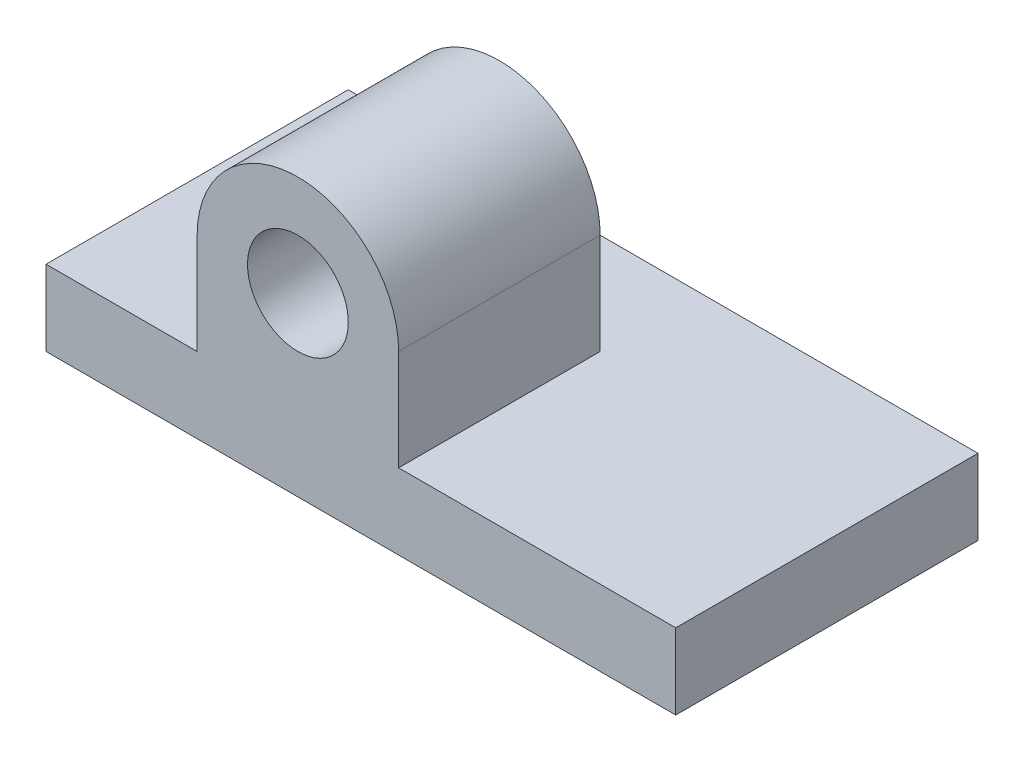
ISO-10303-21;
HEADER;
FILE_DESCRIPTION(('STEP AP214'),'2;1');
FILE_NAME('part.step','',(''),(''),'','','');
FILE_SCHEMA(('AUTOMOTIVE_DESIGN { 1 0 10303 214 1 1 1 1 }'));
ENDSEC;
DATA;
#1=APPLICATION_CONTEXT('core data for automotive mechanical design processes');
#2=APPLICATION_PROTOCOL_DEFINITION('international standard','automotive_design',2000,#1);
#3=PRODUCT_CONTEXT('',#1,'mechanical');
#4=PRODUCT('Part','Part','',(#3));
#5=PRODUCT_RELATED_PRODUCT_CATEGORY('part','',(#4));
#6=PRODUCT_DEFINITION_FORMATION('','',#4);
#7=PRODUCT_DEFINITION_CONTEXT('part definition',#1,'design');
#8=PRODUCT_DEFINITION('design','',#6,#7);
#9=PRODUCT_DEFINITION_SHAPE('','',#8);
#10=(LENGTH_UNIT() NAMED_UNIT(*) SI_UNIT(.MILLI.,.METRE.));
#11=(NAMED_UNIT(*) PLANE_ANGLE_UNIT() SI_UNIT($,.RADIAN.));
#12=(NAMED_UNIT(*) SI_UNIT($,.STERADIAN.) SOLID_ANGLE_UNIT());
#13=UNCERTAINTY_MEASURE_WITH_UNIT(LENGTH_MEASURE(1.E-05),#10,'distance_accuracy_value','');
#14=(GEOMETRIC_REPRESENTATION_CONTEXT(3) GLOBAL_UNCERTAINTY_ASSIGNED_CONTEXT((#13)) GLOBAL_UNIT_ASSIGNED_CONTEXT((#10,
#11,#12)) REPRESENTATION_CONTEXT('',''));
#15=CARTESIAN_POINT('',(0.,0.,0.));
#16=DIRECTION('',(0.,0.,1.));
#17=DIRECTION('',(1.,0.,0.));
#18=AXIS2_PLACEMENT_3D('',#15,#16,#17);
#19=CARTESIAN_POINT('',(0.,15.,-60.));
#20=DIRECTION('',(0.,-1.,0.));
#21=DIRECTION('',(0.,0.,-1.));
#22=AXIS2_PLACEMENT_3D('',#19,#20,#21);
#23=PLANE('',#22);
#24=DIRECTION('',(0.,0.,1.));
#25=VECTOR('',#24,1.);
#26=CARTESIAN_POINT('',(30.,15.,-40.));
#27=LINE('',#26,#25);
#28=CARTESIAN_POINT('',(30.,15.,-40.));
#29=VERTEX_POINT('',#28);
#30=CARTESIAN_POINT('',(30.,15.,0.));
#31=VERTEX_POINT('',#30);
#32=EDGE_CURVE('E133',#29,#31,#27,.T.);
#33=ORIENTED_EDGE('',*,*,#32,.F.);
#34=DIRECTION('',(1.,0.,0.));
#35=VECTOR('',#34,1.);
#36=CARTESIAN_POINT('',(0.,15.,-40.));
#37=LINE('',#36,#35);
#38=CARTESIAN_POINT('',(70.,15.,-40.));
#39=VERTEX_POINT('',#38);
#40=EDGE_CURVE('E117',#29,#39,#37,.T.);
#41=ORIENTED_EDGE('',*,*,#40,.T.);
#42=DIRECTION('',(0.,0.,1.));
#43=VECTOR('',#42,1.);
#44=CARTESIAN_POINT('',(70.,15.,-40.));
#45=LINE('',#44,#43);
#46=CARTESIAN_POINT('',(70.,15.,0.));
#47=VERTEX_POINT('',#46);
#48=EDGE_CURVE('E125',#39,#47,#45,.T.);
#49=ORIENTED_EDGE('',*,*,#48,.T.);
#50=DIRECTION('',(1.,0.,0.));
#51=VECTOR('',#50,1.);
#52=CARTESIAN_POINT('',(0.,15.,0.));
#53=LINE('',#52,#51);
#54=CARTESIAN_POINT('',(125.,15.,0.));
#55=VERTEX_POINT('',#54);
#56=EDGE_CURVE('E169',#47,#55,#53,.T.);
#57=ORIENTED_EDGE('',*,*,#56,.T.);
#58=DIRECTION('',(0.,0.,1.));
#59=VECTOR('',#58,1.);
#60=CARTESIAN_POINT('',(125.,15.,-60.));
#61=LINE('',#60,#59);
#62=CARTESIAN_POINT('',(125.,15.,-60.));
#63=VERTEX_POINT('',#62);
#64=EDGE_CURVE('E172',#63,#55,#61,.T.);
#65=ORIENTED_EDGE('',*,*,#64,.F.);
#66=DIRECTION('',(1.,0.,0.));
#67=VECTOR('',#66,1.);
#68=CARTESIAN_POINT('',(0.,15.,-60.));
#69=LINE('',#68,#67);
#70=CARTESIAN_POINT('',(0.,15.,-60.));
#71=VERTEX_POINT('',#70);
#72=EDGE_CURVE('E163',#71,#63,#69,.T.);
#73=ORIENTED_EDGE('',*,*,#72,.F.);
#74=DIRECTION('',(0.,0.,1.));
#75=VECTOR('',#74,1.);
#76=CARTESIAN_POINT('',(0.,15.,-60.));
#77=LINE('',#76,#75);
#78=CARTESIAN_POINT('',(0.,15.,0.));
#79=VERTEX_POINT('',#78);
#80=EDGE_CURVE('E49',#71,#79,#77,.T.);
#81=ORIENTED_EDGE('',*,*,#80,.T.);
#82=EDGE_CURVE('E173',#79,#31,#53,.T.);
#83=ORIENTED_EDGE('',*,*,#82,.T.);
#84=EDGE_LOOP('',(#33,#41,#49,#57,#65,#73,#81,#83));
#85=FACE_BOUND('',#84,.T.);
#86=ADVANCED_FACE('F41',(#85),#23,.F.);
#87=CARTESIAN_POINT('',(0.,0.,-60.));
#88=DIRECTION('',(0.,-1.,0.));
#89=DIRECTION('',(0.,0.,-1.));
#90=AXIS2_PLACEMENT_3D('',#87,#88,#89);
#91=PLANE('',#90);
#92=DIRECTION('',(1.,0.,0.));
#93=VECTOR('',#92,1.);
#94=CARTESIAN_POINT('',(0.,0.,0.));
#95=LINE('',#94,#93);
#96=CARTESIAN_POINT('',(0.,0.,0.));
#97=VERTEX_POINT('',#96);
#98=CARTESIAN_POINT('',(125.,0.,0.));
#99=VERTEX_POINT('',#98);
#100=EDGE_CURVE('E155',#97,#99,#95,.T.);
#101=ORIENTED_EDGE('',*,*,#100,.F.);
#102=DIRECTION('',(0.,0.,1.));
#103=VECTOR('',#102,1.);
#104=CARTESIAN_POINT('',(0.,0.,-60.));
#105=LINE('',#104,#103);
#106=CARTESIAN_POINT('',(0.,0.,-60.));
#107=VERTEX_POINT('',#106);
#108=EDGE_CURVE('E11',#107,#97,#105,.T.);
#109=ORIENTED_EDGE('',*,*,#108,.F.);
#110=DIRECTION('',(1.,0.,0.));
#111=VECTOR('',#110,1.);
#112=CARTESIAN_POINT('',(0.,0.,-60.));
#113=LINE('',#112,#111);
#114=CARTESIAN_POINT('',(125.,0.,-60.));
#115=VERTEX_POINT('',#114);
#116=EDGE_CURVE('E157',#107,#115,#113,.T.);
#117=ORIENTED_EDGE('',*,*,#116,.T.);
#118=DIRECTION('',(0.,0.,1.));
#119=VECTOR('',#118,1.);
#120=CARTESIAN_POINT('',(125.,0.,-60.));
#121=LINE('',#120,#119);
#122=EDGE_CURVE('E44',#115,#99,#121,.T.);
#123=ORIENTED_EDGE('',*,*,#122,.T.);
#124=EDGE_LOOP('',(#101,#109,#117,#123));
#125=FACE_BOUND('',#124,.T.);
#126=ADVANCED_FACE('F43',(#125),#91,.T.);
#127=CARTESIAN_POINT('',(0.,0.,-60.));
#128=DIRECTION('',(1.,0.,0.));
#129=DIRECTION('',(0.,0.,-1.));
#130=AXIS2_PLACEMENT_3D('',#127,#128,#129);
#131=PLANE('',#130);
#132=DIRECTION('',(0.,1.,0.));
#133=VECTOR('',#132,1.);
#134=CARTESIAN_POINT('',(0.,0.,0.));
#135=LINE('',#134,#133);
#136=EDGE_CURVE('E159',#97,#79,#135,.T.);
#137=ORIENTED_EDGE('',*,*,#136,.T.);
#138=ORIENTED_EDGE('',*,*,#80,.F.);
#139=DIRECTION('',(0.,1.,0.));
#140=VECTOR('',#139,1.);
#141=CARTESIAN_POINT('',(0.,0.,-60.));
#142=LINE('',#141,#140);
#143=EDGE_CURVE('E161',#107,#71,#142,.T.);
#144=ORIENTED_EDGE('',*,*,#143,.F.);
#145=ORIENTED_EDGE('',*,*,#108,.T.);
#146=EDGE_LOOP('',(#137,#138,#144,#145));
#147=FACE_BOUND('',#146,.T.);
#148=ADVANCED_FACE('F184',(#147),#131,.F.);
#149=CARTESIAN_POINT('',(125.,0.,-60.));
#150=DIRECTION('',(1.,0.,0.));
#151=DIRECTION('',(0.,0.,-1.));
#152=AXIS2_PLACEMENT_3D('',#149,#150,#151);
#153=PLANE('',#152);
#154=DIRECTION('',(0.,1.,0.));
#155=VECTOR('',#154,1.);
#156=CARTESIAN_POINT('',(125.,0.,0.));
#157=LINE('',#156,#155);
#158=EDGE_CURVE('E167',#99,#55,#157,.T.);
#159=ORIENTED_EDGE('',*,*,#158,.F.);
#160=ORIENTED_EDGE('',*,*,#122,.F.);
#161=DIRECTION('',(0.,1.,0.));
#162=VECTOR('',#161,1.);
#163=CARTESIAN_POINT('',(125.,0.,-60.));
#164=LINE('',#163,#162);
#165=EDGE_CURVE('E156',#115,#63,#164,.T.);
#166=ORIENTED_EDGE('',*,*,#165,.T.);
#167=ORIENTED_EDGE('',*,*,#64,.T.);
#168=EDGE_LOOP('',(#159,#160,#166,#167));
#169=FACE_BOUND('',#168,.T.);
#170=ADVANCED_FACE('F177',(#169),#153,.T.);
#171=CARTESIAN_POINT('',(0.,0.,-60.));
#172=DIRECTION('',(0.,0.,1.));
#173=DIRECTION('',(1.,0.,0.));
#174=AXIS2_PLACEMENT_3D('',#171,#172,#173);
#175=PLANE('',#174);
#176=ORIENTED_EDGE('',*,*,#116,.F.);
#177=ORIENTED_EDGE('',*,*,#143,.T.);
#178=ORIENTED_EDGE('',*,*,#72,.T.);
#179=ORIENTED_EDGE('',*,*,#165,.F.);
#180=EDGE_LOOP('',(#176,#177,#178,#179));
#181=FACE_BOUND('',#180,.T.);
#182=ADVANCED_FACE('F187',(#181),#175,.F.);
#183=CARTESIAN_POINT('',(0.,0.,0.));
#184=DIRECTION('',(0.,0.,1.));
#185=DIRECTION('',(1.,0.,0.));
#186=AXIS2_PLACEMENT_3D('',#183,#184,#185);
#187=PLANE('',#186);
#188=ORIENTED_EDGE('',*,*,#100,.T.);
#189=ORIENTED_EDGE('',*,*,#158,.T.);
#190=ORIENTED_EDGE('',*,*,#56,.F.);
#191=DIRECTION('',(0.,-1.,0.));
#192=VECTOR('',#191,1.);
#193=CARTESIAN_POINT('',(70.,0.,0.));
#194=LINE('',#193,#192);
#195=CARTESIAN_POINT('',(70.,35.,0.));
#196=VERTEX_POINT('',#195);
#197=EDGE_CURVE('E59',#196,#47,#194,.T.);
#198=ORIENTED_EDGE('',*,*,#197,.F.);
#199=CARTESIAN_POINT('',(50.,35.,0.));
#200=DIRECTION('',(0.,0.,1.));
#201=DIRECTION('',(1.,0.,0.));
#202=AXIS2_PLACEMENT_3D('',#199,#200,#201);
#203=CIRCLE('',#202,20.);
#204=CARTESIAN_POINT('',(30.,35.,0.));
#205=VERTEX_POINT('',#204);
#206=EDGE_CURVE('E147',#196,#205,#203,.T.);
#207=ORIENTED_EDGE('',*,*,#206,.T.);
#208=DIRECTION('',(0.,-1.,0.));
#209=VECTOR('',#208,1.);
#210=CARTESIAN_POINT('',(30.,0.,0.));
#211=LINE('',#210,#209);
#212=EDGE_CURVE('E140',#205,#31,#211,.T.);
#213=ORIENTED_EDGE('',*,*,#212,.T.);
#214=ORIENTED_EDGE('',*,*,#82,.F.);
#215=ORIENTED_EDGE('',*,*,#136,.F.);
#216=EDGE_LOOP('',(#188,#189,#190,#198,#207,#213,#214,#215));
#217=FACE_BOUND('',#216,.T.);
#218=CARTESIAN_POINT('',(50.,35.,0.));
#219=DIRECTION('',(0.,0.,1.));
#220=DIRECTION('',(1.,0.,0.));
#221=AXIS2_PLACEMENT_3D('',#218,#219,#220);
#222=CIRCLE('',#221,10.);
#223=CARTESIAN_POINT('',(60.,35.,0.));
#224=VERTEX_POINT('',#223);
#225=EDGE_CURVE('E132',#224,#224,#222,.T.);
#226=ORIENTED_EDGE('',*,*,#225,.F.);
#227=EDGE_LOOP('',(#226));
#228=FACE_BOUND('',#227,.T.);
#229=ADVANCED_FACE('F181',(#217,#228),#187,.T.);
#230=CARTESIAN_POINT('',(30.,0.,-40.));
#231=DIRECTION('',(-1.,0.,0.));
#232=DIRECTION('',(0.,0.,1.));
#233=AXIS2_PLACEMENT_3D('',#230,#231,#232);
#234=PLANE('',#233);
#235=ORIENTED_EDGE('',*,*,#212,.F.);
#236=DIRECTION('',(0.,0.,1.));
#237=VECTOR('',#236,1.);
#238=CARTESIAN_POINT('',(30.,35.,-40.));
#239=LINE('',#238,#237);
#240=CARTESIAN_POINT('',(30.,35.,-40.));
#241=VERTEX_POINT('',#240);
#242=EDGE_CURVE('E151',#241,#205,#239,.T.);
#243=ORIENTED_EDGE('',*,*,#242,.F.);
#244=DIRECTION('',(0.,-1.,0.));
#245=VECTOR('',#244,1.);
#246=CARTESIAN_POINT('',(30.,0.,-40.));
#247=LINE('',#246,#245);
#248=EDGE_CURVE('E141',#241,#29,#247,.T.);
#249=ORIENTED_EDGE('',*,*,#248,.T.);
#250=ORIENTED_EDGE('',*,*,#32,.T.);
#251=EDGE_LOOP('',(#235,#243,#249,#250));
#252=FACE_BOUND('',#251,.T.);
#253=ADVANCED_FACE('F198',(#252),#234,.T.);
#254=CARTESIAN_POINT('',(50.,35.,-40.));
#255=DIRECTION('',(0.,0.,1.));
#256=DIRECTION('',(1.,0.,0.));
#257=AXIS2_PLACEMENT_3D('',#254,#255,#256);
#258=CYLINDRICAL_SURFACE('',#257,20.);
#259=ORIENTED_EDGE('',*,*,#206,.F.);
#260=DIRECTION('',(0.,0.,1.));
#261=VECTOR('',#260,1.);
#262=CARTESIAN_POINT('',(70.,35.,-40.));
#263=LINE('',#262,#261);
#264=CARTESIAN_POINT('',(70.,35.,-40.));
#265=VERTEX_POINT('',#264);
#266=EDGE_CURVE('E126',#265,#196,#263,.T.);
#267=ORIENTED_EDGE('',*,*,#266,.F.);
#268=CARTESIAN_POINT('',(50.,35.,-40.));
#269=DIRECTION('',(0.,0.,1.));
#270=DIRECTION('',(1.,0.,0.));
#271=AXIS2_PLACEMENT_3D('',#268,#269,#270);
#272=CIRCLE('',#271,20.);
#273=EDGE_CURVE('E122',#265,#241,#272,.T.);
#274=ORIENTED_EDGE('',*,*,#273,.T.);
#275=ORIENTED_EDGE('',*,*,#242,.T.);
#276=EDGE_LOOP('',(#259,#267,#274,#275));
#277=FACE_BOUND('',#276,.T.);
#278=ADVANCED_FACE('F238',(#277),#258,.T.);
#279=CARTESIAN_POINT('',(70.,0.,-40.));
#280=DIRECTION('',(-1.,0.,0.));
#281=DIRECTION('',(0.,0.,1.));
#282=AXIS2_PLACEMENT_3D('',#279,#280,#281);
#283=PLANE('',#282);
#284=ORIENTED_EDGE('',*,*,#197,.T.);
#285=ORIENTED_EDGE('',*,*,#48,.F.);
#286=DIRECTION('',(0.,-1.,0.));
#287=VECTOR('',#286,1.);
#288=CARTESIAN_POINT('',(70.,0.,-40.));
#289=LINE('',#288,#287);
#290=EDGE_CURVE('E114',#265,#39,#289,.T.);
#291=ORIENTED_EDGE('',*,*,#290,.F.);
#292=ORIENTED_EDGE('',*,*,#266,.T.);
#293=EDGE_LOOP('',(#284,#285,#291,#292));
#294=FACE_BOUND('',#293,.T.);
#295=ADVANCED_FACE('F124',(#294),#283,.F.);
#296=CARTESIAN_POINT('',(50.,35.,-40.));
#297=DIRECTION('',(0.,0.,1.));
#298=DIRECTION('',(1.,0.,0.));
#299=AXIS2_PLACEMENT_3D('',#296,#297,#298);
#300=CYLINDRICAL_SURFACE('',#299,10.);
#301=CARTESIAN_POINT('',(50.,35.,-40.));
#302=DIRECTION('',(0.,0.,1.));
#303=DIRECTION('',(1.,0.,0.));
#304=AXIS2_PLACEMENT_3D('',#301,#302,#303);
#305=CIRCLE('',#304,10.);
#306=CARTESIAN_POINT('',(60.,35.,-40.));
#307=VERTEX_POINT('',#306);
#308=EDGE_CURVE('E129',#307,#307,#305,.T.);
#309=ORIENTED_EDGE('',*,*,#308,.F.);
#310=EDGE_LOOP('',(#309));
#311=FACE_BOUND('',#310,.T.);
#312=ORIENTED_EDGE('',*,*,#225,.T.);
#313=EDGE_LOOP('',(#312));
#314=FACE_BOUND('',#313,.T.);
#315=ADVANCED_FACE('F256',(#311,#314),#300,.F.);
#316=CARTESIAN_POINT('',(0.,0.,-40.));
#317=DIRECTION('',(0.,0.,1.));
#318=DIRECTION('',(1.,0.,0.));
#319=AXIS2_PLACEMENT_3D('',#316,#317,#318);
#320=PLANE('',#319);
#321=ORIENTED_EDGE('',*,*,#40,.F.);
#322=ORIENTED_EDGE('',*,*,#248,.F.);
#323=ORIENTED_EDGE('',*,*,#273,.F.);
#324=ORIENTED_EDGE('',*,*,#290,.T.);
#325=EDGE_LOOP('',(#321,#322,#323,#324));
#326=FACE_BOUND('',#325,.T.);
#327=ORIENTED_EDGE('',*,*,#308,.T.);
#328=EDGE_LOOP('',(#327));
#329=FACE_BOUND('',#328,.T.);
#330=ADVANCED_FACE('F113',(#326,#329),#320,.F.);
#331=CLOSED_SHELL('',(#86,#126,#148,#170,#182,#229,#253,#278,#295,#315,#330));
#332=MANIFOLD_SOLID_BREP('B2',#331);
#333=ADVANCED_BREP_SHAPE_REPRESENTATION('',(#18,#332),#14);
#334=SHAPE_DEFINITION_REPRESENTATION(#9,#333);
ENDSEC;
END-ISO-10303-21;
